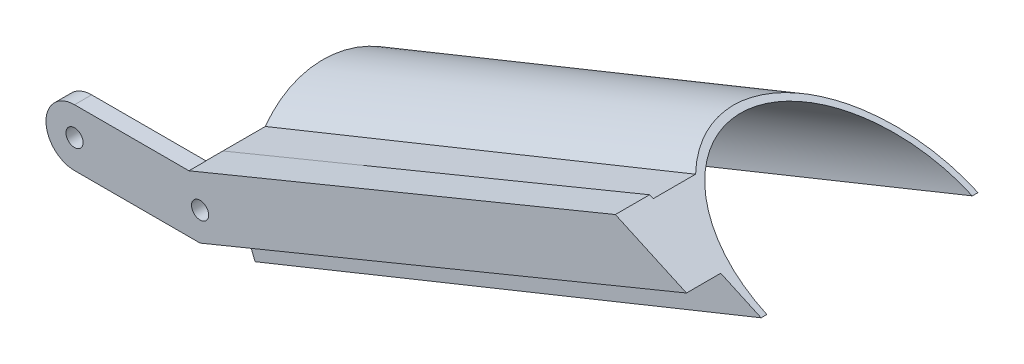
ISO-10303-21;
HEADER;
FILE_DESCRIPTION(('STEP AP214'),'2;1');
FILE_NAME('part.step','',(''),(''),'','','');
FILE_SCHEMA(('AUTOMOTIVE_DESIGN { 1 0 10303 214 1 1 1 1 }'));
ENDSEC;
DATA;
#1=APPLICATION_CONTEXT('core data for automotive mechanical design processes');
#2=APPLICATION_PROTOCOL_DEFINITION('international standard','automotive_design',2000,#1);
#3=PRODUCT_CONTEXT('',#1,'mechanical');
#4=PRODUCT('Part','Part','',(#3));
#5=PRODUCT_RELATED_PRODUCT_CATEGORY('part','',(#4));
#6=PRODUCT_DEFINITION_FORMATION('','',#4);
#7=PRODUCT_DEFINITION_CONTEXT('part definition',#1,'design');
#8=PRODUCT_DEFINITION('design','',#6,#7);
#9=PRODUCT_DEFINITION_SHAPE('','',#8);
#10=(LENGTH_UNIT() NAMED_UNIT(*) SI_UNIT(.MILLI.,.METRE.));
#11=(NAMED_UNIT(*) PLANE_ANGLE_UNIT() SI_UNIT($,.RADIAN.));
#12=(NAMED_UNIT(*) SI_UNIT($,.STERADIAN.) SOLID_ANGLE_UNIT());
#13=UNCERTAINTY_MEASURE_WITH_UNIT(LENGTH_MEASURE(1.E-05),#10,'distance_accuracy_value','');
#14=(GEOMETRIC_REPRESENTATION_CONTEXT(3) GLOBAL_UNCERTAINTY_ASSIGNED_CONTEXT((#13)) GLOBAL_UNIT_ASSIGNED_CONTEXT((#10,
#11,#12)) REPRESENTATION_CONTEXT('',''));
#15=CARTESIAN_POINT('',(0.,0.,0.));
#16=DIRECTION('',(0.,0.,1.));
#17=DIRECTION('',(1.,0.,0.));
#18=AXIS2_PLACEMENT_3D('',#15,#16,#17);
#19=CARTESIAN_POINT('',(22.,0.,-3.));
#20=DIRECTION('',(0.,0.,-1.));
#21=DIRECTION('',(-1.,0.,0.));
#22=AXIS2_PLACEMENT_3D('',#19,#20,#21);
#23=PLANE('',#22);
#24=DIRECTION('',(-0.910039172794663,0.414522259932087,0.));
#25=VECTOR('',#24,1.);
#26=CARTESIAN_POINT('',(47.9776039927981,57.0310440087499,-3.));
#27=LINE('',#26,#25);
#28=CARTESIAN_POINT('',(95.3918753530395,35.433873793622,-3.));
#29=VERTEX_POINT('',#28);
#30=CARTESIAN_POINT('',(94.7654208618462,35.719223412844,-3.));
#31=VERTEX_POINT('',#30);
#32=EDGE_CURVE('E338',#29,#31,#27,.T.);
#33=ORIENTED_EDGE('',*,*,#32,.F.);
#34=DIRECTION('',(-0.927208597794586,-0.374545345953994,0.));
#35=VECTOR('',#34,1.);
#36=CARTESIAN_POINT('',(150.967749391002,57.8837141183942,-3.));
#37=LINE('',#36,#35);
#38=CARTESIAN_POINT('',(19.9901870179728,4.97540790995101,-3.));
#39=VERTEX_POINT('',#38);
#40=EDGE_CURVE('E179',#29,#39,#37,.T.);
#41=ORIENTED_EDGE('',*,*,#40,.T.);
#42=DIRECTION('',(0.924878228166549,0.380263412733207,0.));
#43=VECTOR('',#42,1.);
#44=CARTESIAN_POINT('',(98.5445869727126,37.2730264528967,-3.));
#45=LINE('',#44,#43);
#46=EDGE_CURVE('E200',#39,#31,#45,.T.);
#47=ORIENTED_EDGE('',*,*,#46,.T.);
#48=EDGE_LOOP('',(#33,#41,#47));
#49=FACE_BOUND('',#48,.T.);
#50=ADVANCED_FACE('F42',(#49),#23,.T.);
#51=CARTESIAN_POINT('',(0.,0.,0.));
#52=DIRECTION('',(0.,0.,1.));
#53=DIRECTION('',(1.,0.,0.));
#54=AXIS2_PLACEMENT_3D('',#51,#52,#53);
#55=PLANE('',#54);
#56=CARTESIAN_POINT('',(0.,0.,0.));
#57=DIRECTION('',(0.,0.,1.));
#58=DIRECTION('',(1.,0.,0.));
#59=AXIS2_PLACEMENT_3D('',#56,#57,#58);
#60=CIRCLE('',#59,1.5);
#61=CARTESIAN_POINT('',(1.5,0.,0.));
#62=VERTEX_POINT('',#61);
#63=EDGE_CURVE('E268',#62,#62,#60,.T.);
#64=ORIENTED_EDGE('',*,*,#63,.T.);
#65=EDGE_LOOP('',(#64));
#66=FACE_BOUND('',#65,.T.);
#67=CARTESIAN_POINT('',(22.,0.,0.));
#68=DIRECTION('',(0.,0.,1.));
#69=DIRECTION('',(1.,0.,0.));
#70=AXIS2_PLACEMENT_3D('',#67,#68,#69);
#71=CIRCLE('',#70,1.5);
#72=CARTESIAN_POINT('',(23.5,0.,0.));
#73=VERTEX_POINT('',#72);
#74=EDGE_CURVE('E235',#73,#73,#71,.T.);
#75=ORIENTED_EDGE('',*,*,#74,.T.);
#76=EDGE_LOOP('',(#75));
#77=FACE_BOUND('',#76,.T.);
#78=DIRECTION('',(-0.374545345953993,0.927208597794587,0.));
#79=VECTOR('',#78,1.);
#80=CARTESIAN_POINT('',(22.936363364885,-2.31802149448646,0.));
#81=LINE('',#80,#79);
#82=CARTESIAN_POINT('',(23.7320771990458,-4.28785696671421,0.));
#83=VERTEX_POINT('',#82);
#84=CARTESIAN_POINT('',(22.936363364885,-2.31802149448646,0.));
#85=VERTEX_POINT('',#84);
#86=EDGE_CURVE('E196',#83,#85,#81,.T.);
#87=ORIENTED_EDGE('',*,*,#86,.F.);
#88=DIRECTION('',(-0.924878228166549,-0.380263412733207,0.));
#89=VECTOR('',#88,1.);
#90=CARTESIAN_POINT('',(4.9396925444234,-12.0143404155981,0.));
#91=LINE('',#90,#89);
#92=CARTESIAN_POINT('',(22.,-5.,0.));
#93=VERTEX_POINT('',#92);
#94=EDGE_CURVE('E272',#83,#93,#91,.T.);
#95=ORIENTED_EDGE('',*,*,#94,.T.);
#96=DIRECTION('',(1.,0.,0.));
#97=VECTOR('',#96,1.);
#98=CARTESIAN_POINT('',(0.,-5.,0.));
#99=LINE('',#98,#97);
#100=CARTESIAN_POINT('',(0.,-5.,0.));
#101=VERTEX_POINT('',#100);
#102=EDGE_CURVE('E241',#101,#93,#99,.T.);
#103=ORIENTED_EDGE('',*,*,#102,.F.);
#104=CARTESIAN_POINT('',(0.,0.,0.));
#105=DIRECTION('',(0.,0.,1.));
#106=DIRECTION('',(1.,0.,0.));
#107=AXIS2_PLACEMENT_3D('',#104,#105,#106);
#108=CIRCLE('',#107,5.);
#109=CARTESIAN_POINT('',(0.,5.,0.));
#110=VERTEX_POINT('',#109);
#111=EDGE_CURVE('E278',#110,#101,#108,.T.);
#112=ORIENTED_EDGE('',*,*,#111,.F.);
#113=DIRECTION('',(1.,0.,0.));
#114=VECTOR('',#113,1.);
#115=CARTESIAN_POINT('',(0.,5.,0.));
#116=LINE('',#115,#114);
#117=CARTESIAN_POINT('',(20.05,5.,0.));
#118=VERTEX_POINT('',#117);
#119=EDGE_CURVE('E275',#110,#118,#116,.T.);
#120=ORIENTED_EDGE('',*,*,#119,.T.);
#121=DIRECTION('',(0.924878228166549,0.380263412733207,0.));
#122=VECTOR('',#121,1.);
#123=CARTESIAN_POINT('',(98.5445869727126,37.2730264528967,0.));
#124=LINE('',#123,#122);
#125=CARTESIAN_POINT('',(19.9901870179728,4.97540790995101,0.));
#126=VERTEX_POINT('',#125);
#127=EDGE_CURVE('E65',#126,#118,#124,.T.);
#128=ORIENTED_EDGE('',*,*,#127,.F.);
#129=DIRECTION('',(-0.374545345953994,0.927208597794586,0.));
#130=VECTOR('',#129,1.);
#131=CARTESIAN_POINT('',(19.9901870179728,4.97540790995101,0.));
#132=LINE('',#131,#130);
#133=CARTESIAN_POINT('',(21.063636635115,2.31802149448647,0.));
#134=VERTEX_POINT('',#133);
#135=EDGE_CURVE('E215',#134,#126,#132,.T.);
#136=ORIENTED_EDGE('',*,*,#135,.F.);
#137=CARTESIAN_POINT('',(22.,0.,0.));
#138=DIRECTION('',(0.,0.,1.));
#139=DIRECTION('',(-1.,0.,0.));
#140=AXIS2_PLACEMENT_3D('',#137,#138,#139);
#141=CIRCLE('',#140,2.5);
#142=EDGE_CURVE('E211',#85,#134,#141,.T.);
#143=ORIENTED_EDGE('',*,*,#142,.F.);
#144=EDGE_LOOP('',(#87,#95,#103,#112,#120,#128,#136,#143));
#145=FACE_BOUND('',#144,.T.);
#146=ADVANCED_FACE('F302',(#66,#77,#145),#55,.F.);
#147=CARTESIAN_POINT('',(4.9396925444234,-12.0143404155981,3.));
#148=DIRECTION('',(0.380263412733207,-0.924878228166549,0.));
#149=DIRECTION('',(0.924878228166549,0.380263412733207,0.));
#150=AXIS2_PLACEMENT_3D('',#147,#148,#149);
#151=PLANE('',#150);
#152=DIRECTION('',(0.,0.,-1.));
#153=VECTOR('',#152,1.);
#154=CARTESIAN_POINT('',(107.229222357976,30.0419698198423,3.));
#155=LINE('',#154,#153);
#156=CARTESIAN_POINT('',(107.229222357976,30.0419698198423,3.));
#157=VERTEX_POINT('',#156);
#158=CARTESIAN_POINT('',(107.229222357976,30.0419698198423,-3.));
#159=VERTEX_POINT('',#158);
#160=EDGE_CURVE('E157',#157,#159,#155,.T.);
#161=ORIENTED_EDGE('',*,*,#160,.F.);
#162=DIRECTION('',(-0.924878228166549,-0.380263412733207,0.));
#163=VECTOR('',#162,1.);
#164=CARTESIAN_POINT('',(4.9396925444234,-12.0143404155981,3.));
#165=LINE('',#164,#163);
#166=CARTESIAN_POINT('',(22.,-5.,3.));
#167=VERTEX_POINT('',#166);
#168=EDGE_CURVE('E245',#157,#167,#165,.T.);
#169=ORIENTED_EDGE('',*,*,#168,.T.);
#170=DIRECTION('',(0.,0.,-1.));
#171=VECTOR('',#170,1.);
#172=CARTESIAN_POINT('',(22.,-5.,3.));
#173=LINE('',#172,#171);
#174=EDGE_CURVE('E264',#167,#93,#173,.T.);
#175=ORIENTED_EDGE('',*,*,#174,.T.);
#176=ORIENTED_EDGE('',*,*,#94,.F.);
#177=DIRECTION('',(0.,0.,1.));
#178=VECTOR('',#177,1.);
#179=CARTESIAN_POINT('',(23.7320771990458,-4.28785696671419,-3.));
#180=LINE('',#179,#178);
#181=CARTESIAN_POINT('',(23.7320771990458,-4.28785696671419,-3.));
#182=VERTEX_POINT('',#181);
#183=EDGE_CURVE('E207',#182,#83,#180,.T.);
#184=ORIENTED_EDGE('',*,*,#183,.F.);
#185=DIRECTION('',(-0.924878228166549,-0.380263412733207,0.));
#186=VECTOR('',#185,1.);
#187=CARTESIAN_POINT('',(111.008388468843,31.595772859895,-3.));
#188=LINE('',#187,#186);
#189=EDGE_CURVE('E204',#159,#182,#188,.T.);
#190=ORIENTED_EDGE('',*,*,#189,.F.);
#191=EDGE_LOOP('',(#161,#169,#175,#176,#184,#190));
#192=FACE_BOUND('',#191,.T.);
#193=ADVANCED_FACE('F322',(#192),#151,.T.);
#194=CARTESIAN_POINT('',(1.14074851739701,-2.77453321099285,3.));
#195=DIRECTION('',(-0.380263412733207,0.924878228166549,0.));
#196=DIRECTION('',(-0.924878228166549,-0.380263412733207,0.));
#197=AXIS2_PLACEMENT_3D('',#194,#195,#196);
#198=PLANE('',#197);
#199=DIRECTION('',(0.,0.,1.));
#200=VECTOR('',#199,1.);
#201=CARTESIAN_POINT('',(94.7654208618463,35.7192234128439,3.));
#202=LINE('',#201,#200);
#203=CARTESIAN_POINT('',(94.7654208618463,35.7192234128439,3.));
#204=VERTEX_POINT('',#203);
#205=EDGE_CURVE('E336',#31,#204,#202,.T.);
#206=ORIENTED_EDGE('',*,*,#205,.F.);
#207=ORIENTED_EDGE('',*,*,#46,.F.);
#208=DIRECTION('',(0.,0.,1.));
#209=VECTOR('',#208,1.);
#210=CARTESIAN_POINT('',(19.9901870179728,4.97540790995101,-3.));
#211=LINE('',#210,#209);
#212=EDGE_CURVE('E223',#39,#126,#211,.T.);
#213=ORIENTED_EDGE('',*,*,#212,.T.);
#214=ORIENTED_EDGE('',*,*,#127,.T.);
#215=DIRECTION('',(0.,0.,-1.));
#216=VECTOR('',#215,1.);
#217=CARTESIAN_POINT('',(20.05,5.,3.));
#218=LINE('',#217,#216);
#219=CARTESIAN_POINT('',(20.05,5.,3.));
#220=VERTEX_POINT('',#219);
#221=EDGE_CURVE('E51',#220,#118,#218,.T.);
#222=ORIENTED_EDGE('',*,*,#221,.F.);
#223=DIRECTION('',(0.924878228166549,0.380263412733207,0.));
#224=VECTOR('',#223,1.);
#225=CARTESIAN_POINT('',(1.14074851739701,-2.77453321099285,3.));
#226=LINE('',#225,#224);
#227=EDGE_CURVE('E248',#220,#204,#226,.T.);
#228=ORIENTED_EDGE('',*,*,#227,.T.);
#229=EDGE_LOOP('',(#206,#207,#213,#214,#222,#228));
#230=FACE_BOUND('',#229,.T.);
#231=ADVANCED_FACE('F304',(#230),#198,.T.);
#232=CARTESIAN_POINT('',(0.,5.,3.));
#233=DIRECTION('',(0.,1.,0.));
#234=DIRECTION('',(0.,0.,1.));
#235=AXIS2_PLACEMENT_3D('',#232,#233,#234);
#236=PLANE('',#235);
#237=ORIENTED_EDGE('',*,*,#119,.F.);
#238=DIRECTION('',(0.,0.,-1.));
#239=VECTOR('',#238,1.);
#240=CARTESIAN_POINT('',(0.,5.,3.));
#241=LINE('',#240,#239);
#242=CARTESIAN_POINT('',(0.,5.,3.));
#243=VERTEX_POINT('',#242);
#244=EDGE_CURVE('E292',#243,#110,#241,.T.);
#245=ORIENTED_EDGE('',*,*,#244,.F.);
#246=DIRECTION('',(1.,0.,0.));
#247=VECTOR('',#246,1.);
#248=CARTESIAN_POINT('',(0.,5.,3.));
#249=LINE('',#248,#247);
#250=EDGE_CURVE('E252',#243,#220,#249,.T.);
#251=ORIENTED_EDGE('',*,*,#250,.T.);
#252=ORIENTED_EDGE('',*,*,#221,.T.);
#253=EDGE_LOOP('',(#237,#245,#251,#252));
#254=FACE_BOUND('',#253,.T.);
#255=ADVANCED_FACE('F297',(#254),#236,.T.);
#256=CARTESIAN_POINT('',(0.,0.,3.));
#257=DIRECTION('',(0.,0.,-1.));
#258=DIRECTION('',(-1.,0.,0.));
#259=AXIS2_PLACEMENT_3D('',#256,#257,#258);
#260=CYLINDRICAL_SURFACE('',#259,5.);
#261=ORIENTED_EDGE('',*,*,#111,.T.);
#262=DIRECTION('',(0.,0.,-1.));
#263=VECTOR('',#262,1.);
#264=CARTESIAN_POINT('',(0.,-5.,3.));
#265=LINE('',#264,#263);
#266=CARTESIAN_POINT('',(0.,-5.,3.));
#267=VERTEX_POINT('',#266);
#268=EDGE_CURVE('E288',#267,#101,#265,.T.);
#269=ORIENTED_EDGE('',*,*,#268,.F.);
#270=CARTESIAN_POINT('',(0.,0.,3.));
#271=DIRECTION('',(0.,0.,1.));
#272=DIRECTION('',(1.,0.,0.));
#273=AXIS2_PLACEMENT_3D('',#270,#271,#272);
#274=CIRCLE('',#273,5.);
#275=EDGE_CURVE('E256',#243,#267,#274,.T.);
#276=ORIENTED_EDGE('',*,*,#275,.F.);
#277=ORIENTED_EDGE('',*,*,#244,.T.);
#278=EDGE_LOOP('',(#261,#269,#276,#277));
#279=FACE_BOUND('',#278,.T.);
#280=ADVANCED_FACE('F330',(#279),#260,.T.);
#281=CARTESIAN_POINT('',(0.,0.,3.));
#282=DIRECTION('',(0.,0.,-1.));
#283=DIRECTION('',(-1.,0.,0.));
#284=AXIS2_PLACEMENT_3D('',#281,#282,#283);
#285=CYLINDRICAL_SURFACE('',#284,1.5);
#286=CARTESIAN_POINT('',(0.,0.,3.));
#287=DIRECTION('',(0.,0.,1.));
#288=DIRECTION('',(1.,0.,0.));
#289=AXIS2_PLACEMENT_3D('',#286,#287,#288);
#290=CIRCLE('',#289,1.5);
#291=CARTESIAN_POINT('',(1.5,0.,3.));
#292=VERTEX_POINT('',#291);
#293=EDGE_CURVE('E240',#292,#292,#290,.T.);
#294=ORIENTED_EDGE('',*,*,#293,.T.);
#295=EDGE_LOOP('',(#294));
#296=FACE_BOUND('',#295,.T.);
#297=ORIENTED_EDGE('',*,*,#63,.F.);
#298=EDGE_LOOP('',(#297));
#299=FACE_BOUND('',#298,.T.);
#300=ADVANCED_FACE('F417',(#296,#299),#285,.F.);
#301=CARTESIAN_POINT('',(22.,0.,3.));
#302=DIRECTION('',(0.,0.,-1.));
#303=DIRECTION('',(-1.,0.,0.));
#304=AXIS2_PLACEMENT_3D('',#301,#302,#303);
#305=CYLINDRICAL_SURFACE('',#304,1.5);
#306=CARTESIAN_POINT('',(22.,0.,3.));
#307=DIRECTION('',(0.,0.,1.));
#308=DIRECTION('',(1.,0.,0.));
#309=AXIS2_PLACEMENT_3D('',#306,#307,#308);
#310=CIRCLE('',#309,1.5);
#311=CARTESIAN_POINT('',(23.5,0.,3.));
#312=VERTEX_POINT('',#311);
#313=EDGE_CURVE('E236',#312,#312,#310,.T.);
#314=ORIENTED_EDGE('',*,*,#313,.T.);
#315=EDGE_LOOP('',(#314));
#316=FACE_BOUND('',#315,.T.);
#317=ORIENTED_EDGE('',*,*,#74,.F.);
#318=EDGE_LOOP('',(#317));
#319=FACE_BOUND('',#318,.T.);
#320=ADVANCED_FACE('F44',(#316,#319),#305,.F.);
#321=CARTESIAN_POINT('',(0.,-5.,3.));
#322=DIRECTION('',(0.,1.,0.));
#323=DIRECTION('',(0.,0.,1.));
#324=AXIS2_PLACEMENT_3D('',#321,#322,#323);
#325=PLANE('',#324);
#326=ORIENTED_EDGE('',*,*,#102,.T.);
#327=ORIENTED_EDGE('',*,*,#174,.F.);
#328=DIRECTION('',(1.,0.,0.));
#329=VECTOR('',#328,1.);
#330=CARTESIAN_POINT('',(0.,-5.,3.));
#331=LINE('',#330,#329);
#332=EDGE_CURVE('E260',#267,#167,#331,.T.);
#333=ORIENTED_EDGE('',*,*,#332,.F.);
#334=ORIENTED_EDGE('',*,*,#268,.T.);
#335=EDGE_LOOP('',(#326,#327,#333,#334));
#336=FACE_BOUND('',#335,.T.);
#337=ADVANCED_FACE('F326',(#336),#325,.F.);
#338=CARTESIAN_POINT('',(0.,0.,3.));
#339=DIRECTION('',(0.,0.,1.));
#340=DIRECTION('',(1.,0.,0.));
#341=AXIS2_PLACEMENT_3D('',#338,#339,#340);
#342=PLANE('',#341);
#343=DIRECTION('',(0.910039172794663,-0.414522259932087,0.));
#344=VECTOR('',#343,1.);
#345=CARTESIAN_POINT('',(29.7578354803406,65.3301368884884,3.));
#346=LINE('',#345,#344);
#347=EDGE_CURVE('E335',#204,#157,#346,.T.);
#348=ORIENTED_EDGE('',*,*,#347,.F.);
#349=ORIENTED_EDGE('',*,*,#227,.F.);
#350=ORIENTED_EDGE('',*,*,#250,.F.);
#351=ORIENTED_EDGE('',*,*,#275,.T.);
#352=ORIENTED_EDGE('',*,*,#332,.T.);
#353=ORIENTED_EDGE('',*,*,#168,.F.);
#354=EDGE_LOOP('',(#348,#349,#350,#351,#352,#353));
#355=FACE_BOUND('',#354,.T.);
#356=ORIENTED_EDGE('',*,*,#313,.F.);
#357=EDGE_LOOP('',(#356));
#358=FACE_BOUND('',#357,.T.);
#359=ORIENTED_EDGE('',*,*,#293,.F.);
#360=EDGE_LOOP('',(#359));
#361=FACE_BOUND('',#360,.T.);
#362=ADVANCED_FACE('F333',(#355,#358,#361),#342,.T.);
#363=CARTESIAN_POINT('',(22.936363364885,-2.31802149448646,-3.));
#364=DIRECTION('',(0.927208597794587,0.374545345953993,0.));
#365=DIRECTION('',(-0.374545345953993,0.927208597794587,0.));
#366=AXIS2_PLACEMENT_3D('',#363,#364,#365);
#367=PLANE('',#366);
#368=ORIENTED_EDGE('',*,*,#86,.T.);
#369=DIRECTION('',(0.,0.,1.));
#370=VECTOR('',#369,1.);
#371=CARTESIAN_POINT('',(22.936363364885,-2.31802149448646,-3.));
#372=LINE('',#371,#370);
#373=CARTESIAN_POINT('',(22.936363364885,-2.31802149448646,-3.));
#374=VERTEX_POINT('',#373);
#375=EDGE_CURVE('E231',#374,#85,#372,.T.);
#376=ORIENTED_EDGE('',*,*,#375,.F.);
#377=DIRECTION('',(-0.374545345953994,0.927208597794586,0.));
#378=VECTOR('',#377,1.);
#379=CARTESIAN_POINT('',(25.6368359347664,-9.00319703317821,-3.00000000000001));
#380=LINE('',#379,#378);
#381=CARTESIAN_POINT('',(21.063636635115,2.31802149448647,-3.));
#382=VERTEX_POINT('',#381);
#383=EDGE_CURVE('E365',#374,#382,#380,.T.);
#384=ORIENTED_EDGE('',*,*,#383,.T.);
#385=DIRECTION('',(0.,0.,1.));
#386=VECTOR('',#385,1.);
#387=CARTESIAN_POINT('',(21.063636635115,2.31802149448647,-3.));
#388=LINE('',#387,#386);
#389=EDGE_CURVE('E227',#382,#134,#388,.T.);
#390=ORIENTED_EDGE('',*,*,#389,.T.);
#391=ORIENTED_EDGE('',*,*,#135,.T.);
#392=ORIENTED_EDGE('',*,*,#212,.F.);
#393=DIRECTION('',(0.,0.,-1.));
#394=VECTOR('',#393,1.);
#395=CARTESIAN_POINT('',(19.9901870179728,4.975407909951,-3.));
#396=LINE('',#395,#394);
#397=CARTESIAN_POINT('',(19.9901870179728,4.975407909951,-10.4365247501282));
#398=VERTEX_POINT('',#397);
#399=EDGE_CURVE('E312',#39,#398,#396,.T.);
#400=ORIENTED_EDGE('',*,*,#399,.T.);
#401=CARTESIAN_POINT('',(25.6368359347664,-9.00319703317821,-22.));
#402=DIRECTION('',(-0.927208597794586,-0.374545345953994,0.));
#403=DIRECTION('',(0.374545345953994,-0.927208597794586,0.));
#404=AXIS2_PLACEMENT_3D('',#401,#402,#403);
#405=CIRCLE('',#404,19.);
#406=CARTESIAN_POINT('',(25.6368359347664,-9.00319703317821,-41.));
#407=VERTEX_POINT('',#406);
#408=EDGE_CURVE('E348',#398,#407,#405,.T.);
#409=ORIENTED_EDGE('',*,*,#408,.T.);
#410=DIRECTION('',(0.,0.,1.));
#411=VECTOR('',#410,1.);
#412=CARTESIAN_POINT('',(25.6368359347664,-9.00319703317821,-41.));
#413=LINE('',#412,#411);
#414=CARTESIAN_POINT('',(25.6368359347664,-9.00319703317821,-40.));
#415=VERTEX_POINT('',#414);
#416=EDGE_CURVE('E351',#407,#415,#413,.T.);
#417=ORIENTED_EDGE('',*,*,#416,.T.);
#418=CARTESIAN_POINT('',(25.6368359347664,-9.00319703317821,-22.));
#419=DIRECTION('',(0.927208597794586,0.374545345953994,0.));
#420=DIRECTION('',(0.374545345953994,-0.927208597794586,0.));
#421=AXIS2_PLACEMENT_3D('',#418,#419,#420);
#422=CIRCLE('',#421,18.);
#423=CARTESIAN_POINT('',(25.6368359347664,-9.00319703317821,-4.));
#424=VERTEX_POINT('',#423);
#425=EDGE_CURVE('E358',#415,#424,#422,.T.);
#426=ORIENTED_EDGE('',*,*,#425,.T.);
#427=DIRECTION('',(0.,0.,1.));
#428=VECTOR('',#427,1.);
#429=CARTESIAN_POINT('',(25.6368359347664,-9.00319703317821,-3.00000000000001));
#430=LINE('',#429,#428);
#431=CARTESIAN_POINT('',(25.6368359347664,-9.00319703317821,-3.00000000000001));
#432=VERTEX_POINT('',#431);
#433=EDGE_CURVE('E362',#424,#432,#430,.T.);
#434=ORIENTED_EDGE('',*,*,#433,.T.);
#435=EDGE_CURVE('E177',#432,#182,#380,.T.);
#436=ORIENTED_EDGE('',*,*,#435,.T.);
#437=ORIENTED_EDGE('',*,*,#183,.T.);
#438=EDGE_LOOP('',(#368,#376,#384,#390,#391,#392,#400,#409,#417,#426,#434,#436,#437));
#439=FACE_BOUND('',#438,.T.);
#440=ADVANCED_FACE('F309',(#439),#367,.F.);
#441=CARTESIAN_POINT('',(22.,0.,-3.));
#442=DIRECTION('',(0.,0.,1.));
#443=DIRECTION('',(1.,0.,0.));
#444=AXIS2_PLACEMENT_3D('',#441,#442,#443);
#445=CYLINDRICAL_SURFACE('',#444,2.5);
#446=ORIENTED_EDGE('',*,*,#142,.T.);
#447=ORIENTED_EDGE('',*,*,#389,.F.);
#448=CARTESIAN_POINT('',(22.,0.,-3.));
#449=DIRECTION('',(0.,0.,1.));
#450=DIRECTION('',(-1.,0.,0.));
#451=AXIS2_PLACEMENT_3D('',#448,#449,#450);
#452=CIRCLE('',#451,2.5);
#453=EDGE_CURVE('E197',#374,#382,#452,.T.);
#454=ORIENTED_EDGE('',*,*,#453,.F.);
#455=ORIENTED_EDGE('',*,*,#375,.T.);
#456=EDGE_LOOP('',(#446,#447,#454,#455));
#457=FACE_BOUND('',#456,.T.);
#458=ADVANCED_FACE('F316',(#457),#445,.F.);
#459=CARTESIAN_POINT('',(156.614398307796,43.905109175265,-3.00000000000001));
#460=DIRECTION('',(0.,0.,1.));
#461=DIRECTION('',(0.,-1.,0.));
#462=AXIS2_PLACEMENT_3D('',#459,#460,#461);
#463=PLANE('',#462);
#464=ORIENTED_EDGE('',*,*,#383,.F.);
#465=ORIENTED_EDGE('',*,*,#453,.T.);
#466=EDGE_LOOP('',(#464,#465));
#467=FACE_BOUND('',#466,.T.);
#468=ADVANCED_FACE('F408',(#467),#463,.T.);
#469=CARTESIAN_POINT('',(156.614398307796,43.905109175265,-22.));
#470=DIRECTION('',(-0.927208597794586,-0.374545345953994,0.));
#471=DIRECTION('',(0.374545345953994,-0.927208597794586,0.));
#472=AXIS2_PLACEMENT_3D('',#469,#470,#471);
#473=CYLINDRICAL_SURFACE('',#472,19.);
#474=CARTESIAN_POINT('',(114.310473312684,26.8164645485937,-22.));
#475=DIRECTION('',(-0.414522259932087,-0.910039172794663,0.));
#476=DIRECTION('',(-0.910039172794663,0.414522259932087,0.));
#477=AXIS2_PLACEMENT_3D('',#474,#475,#476);
#478=ELLIPSE('',#477,26.1996856685276,19.);
#479=CARTESIAN_POINT('',(114.310473312684,26.8164645485937,-41.));
#480=VERTEX_POINT('',#479);
#481=CARTESIAN_POINT('',(95.3918753530395,35.433873793622,-10.4365247501282));
#482=VERTEX_POINT('',#481);
#483=EDGE_CURVE('E57',#480,#482,#478,.F.);
#484=ORIENTED_EDGE('',*,*,#483,.F.);
#485=DIRECTION('',(-0.927208597794586,-0.374545345953994,0.));
#486=VECTOR('',#485,1.);
#487=CARTESIAN_POINT('',(156.614398307796,43.905109175265,-41.));
#488=LINE('',#487,#486);
#489=EDGE_CURVE('E191',#480,#407,#488,.T.);
#490=ORIENTED_EDGE('',*,*,#489,.T.);
#491=ORIENTED_EDGE('',*,*,#408,.F.);
#492=DIRECTION('',(-0.927208597794586,-0.374545345953994,0.));
#493=VECTOR('',#492,1.);
#494=CARTESIAN_POINT('',(150.967749391002,57.8837141183942,-10.4365247501282));
#495=LINE('',#494,#493);
#496=EDGE_CURVE('E183',#482,#398,#495,.T.);
#497=ORIENTED_EDGE('',*,*,#496,.F.);
#498=EDGE_LOOP('',(#484,#490,#491,#497));
#499=FACE_BOUND('',#498,.T.);
#500=ADVANCED_FACE('F383',(#499),#473,.T.);
#501=CARTESIAN_POINT('',(156.614398307796,43.905109175265,-41.));
#502=DIRECTION('',(0.374545345953994,-0.927208597794586,0.));
#503=DIRECTION('',(0.927208597794586,0.374545345953994,0.));
#504=AXIS2_PLACEMENT_3D('',#501,#502,#503);
#505=PLANE('',#504);
#506=DIRECTION('',(0.,0.,-1.));
#507=VECTOR('',#506,1.);
#508=CARTESIAN_POINT('',(114.310473312684,26.8164645485937,45.));
#509=LINE('',#508,#507);
#510=CARTESIAN_POINT('',(114.310473312684,26.8164645485937,-40.));
#511=VERTEX_POINT('',#510);
#512=EDGE_CURVE('E172',#511,#480,#509,.T.);
#513=ORIENTED_EDGE('',*,*,#512,.F.);
#514=DIRECTION('',(-0.927208597794586,-0.374545345953994,0.));
#515=VECTOR('',#514,1.);
#516=CARTESIAN_POINT('',(156.614398307796,43.905109175265,-40.));
#517=LINE('',#516,#515);
#518=EDGE_CURVE('E185',#511,#415,#517,.T.);
#519=ORIENTED_EDGE('',*,*,#518,.T.);
#520=ORIENTED_EDGE('',*,*,#416,.F.);
#521=ORIENTED_EDGE('',*,*,#489,.F.);
#522=EDGE_LOOP('',(#513,#519,#520,#521));
#523=FACE_BOUND('',#522,.T.);
#524=ADVANCED_FACE('F381',(#523),#505,.T.);
#525=CARTESIAN_POINT('',(156.614398307796,43.905109175265,-22.));
#526=DIRECTION('',(-0.927208597794586,-0.374545345953994,0.));
#527=DIRECTION('',(0.374545345953994,-0.927208597794586,0.));
#528=AXIS2_PLACEMENT_3D('',#525,#526,#527);
#529=CYLINDRICAL_SURFACE('',#528,18.);
#530=CARTESIAN_POINT('',(114.310473312684,26.8164645485937,-22.));
#531=DIRECTION('',(-0.414522259932087,-0.910039172794663,0.));
#532=DIRECTION('',(-0.910039172794663,0.414522259932087,0.));
#533=AXIS2_PLACEMENT_3D('',#530,#531,#532);
#534=ELLIPSE('',#533,24.8207548438683,18.);
#535=CARTESIAN_POINT('',(114.310473312684,26.8164645485937,-4.));
#536=VERTEX_POINT('',#535);
#537=EDGE_CURVE('E162',#536,#511,#534,.T.);
#538=ORIENTED_EDGE('',*,*,#537,.F.);
#539=DIRECTION('',(-0.927208597794586,-0.374545345953994,0.));
#540=VECTOR('',#539,1.);
#541=CARTESIAN_POINT('',(156.614398307796,43.905109175265,-4.));
#542=LINE('',#541,#540);
#543=EDGE_CURVE('E170',#536,#424,#542,.T.);
#544=ORIENTED_EDGE('',*,*,#543,.T.);
#545=ORIENTED_EDGE('',*,*,#425,.F.);
#546=ORIENTED_EDGE('',*,*,#518,.F.);
#547=EDGE_LOOP('',(#538,#544,#545,#546));
#548=FACE_BOUND('',#547,.T.);
#549=ADVANCED_FACE('F386',(#548),#529,.F.);
#550=CARTESIAN_POINT('',(156.614398307796,43.905109175265,-3.00000000000001));
#551=DIRECTION('',(0.374545345953994,-0.927208597794586,0.));
#552=DIRECTION('',(0.927208597794586,0.374545345953994,0.));
#553=AXIS2_PLACEMENT_3D('',#550,#551,#552);
#554=PLANE('',#553);
#555=CARTESIAN_POINT('',(114.310473312684,26.8164645485937,-3.));
#556=VERTEX_POINT('',#555);
#557=EDGE_CURVE('E154',#556,#536,#509,.T.);
#558=ORIENTED_EDGE('',*,*,#557,.F.);
#559=DIRECTION('',(-0.927208597794586,-0.374545345953994,0.));
#560=VECTOR('',#559,1.);
#561=CARTESIAN_POINT('',(156.614398307796,43.905109175265,-3.00000000000001));
#562=LINE('',#561,#560);
#563=EDGE_CURVE('E168',#556,#432,#562,.T.);
#564=ORIENTED_EDGE('',*,*,#563,.T.);
#565=ORIENTED_EDGE('',*,*,#433,.F.);
#566=ORIENTED_EDGE('',*,*,#543,.F.);
#567=EDGE_LOOP('',(#558,#564,#565,#566));
#568=FACE_BOUND('',#567,.T.);
#569=ADVANCED_FACE('F166',(#568),#554,.T.);
#570=DIRECTION('',(0.910039172794663,-0.414522259932087,0.));
#571=VECTOR('',#570,1.);
#572=CARTESIAN_POINT('',(142.89899475058,13.7944113570139,-3.00000000000002));
#573=LINE('',#572,#571);
#574=EDGE_CURVE('E151',#159,#556,#573,.T.);
#575=ORIENTED_EDGE('',*,*,#574,.F.);
#576=ORIENTED_EDGE('',*,*,#189,.T.);
#577=ORIENTED_EDGE('',*,*,#435,.F.);
#578=ORIENTED_EDGE('',*,*,#563,.F.);
#579=EDGE_LOOP('',(#575,#576,#577,#578));
#580=FACE_BOUND('',#579,.T.);
#581=ADVANCED_FACE('F175',(#580),#463,.T.);
#582=CARTESIAN_POINT('',(150.967749391002,57.8837141183942,-3.));
#583=DIRECTION('',(-0.374545345953994,0.927208597794586,0.));
#584=DIRECTION('',(-0.927208597794586,-0.374545345953994,0.));
#585=AXIS2_PLACEMENT_3D('',#582,#583,#584);
#586=PLANE('',#585);
#587=DIRECTION('',(0.,0.,1.));
#588=VECTOR('',#587,1.);
#589=CARTESIAN_POINT('',(95.3918753530395,35.433873793622,-3.00000000000003));
#590=LINE('',#589,#588);
#591=EDGE_CURVE('E11',#482,#29,#590,.T.);
#592=ORIENTED_EDGE('',*,*,#591,.F.);
#593=ORIENTED_EDGE('',*,*,#496,.T.);
#594=ORIENTED_EDGE('',*,*,#399,.F.);
#595=ORIENTED_EDGE('',*,*,#40,.F.);
#596=EDGE_LOOP('',(#592,#593,#594,#595));
#597=FACE_BOUND('',#596,.T.);
#598=ADVANCED_FACE('F344',(#597),#586,.T.);
#599=CARTESIAN_POINT('',(114.310473312684,26.8164645485937,45.));
#600=DIRECTION('',(-0.414522259932087,-0.910039172794663,0.));
#601=DIRECTION('',(0.910039172794663,-0.414522259932087,0.));
#602=AXIS2_PLACEMENT_3D('',#599,#600,#601);
#603=PLANE('',#602);
#604=ORIENTED_EDGE('',*,*,#537,.T.);
#605=ORIENTED_EDGE('',*,*,#512,.T.);
#606=ORIENTED_EDGE('',*,*,#483,.T.);
#607=ORIENTED_EDGE('',*,*,#591,.T.);
#608=ORIENTED_EDGE('',*,*,#32,.T.);
#609=ORIENTED_EDGE('',*,*,#205,.T.);
#610=ORIENTED_EDGE('',*,*,#347,.T.);
#611=ORIENTED_EDGE('',*,*,#160,.T.);
#612=ORIENTED_EDGE('',*,*,#574,.T.);
#613=ORIENTED_EDGE('',*,*,#557,.T.);
#614=EDGE_LOOP('',(#604,#605,#606,#607,#608,#609,#610,#611,#612,#613));
#615=FACE_BOUND('',#614,.T.);
#616=ADVANCED_FACE('F153',(#615),#603,.F.);
#617=CLOSED_SHELL('',(#50,#146,#193,#231,#255,#280,#300,#320,#337,#362,#440,#458,#468,#500,#524,
#549,#569,#581,#598,#616));
#618=MANIFOLD_SOLID_BREP('B2',#617);
#619=ADVANCED_BREP_SHAPE_REPRESENTATION('',(#18,#618),#14);
#620=SHAPE_DEFINITION_REPRESENTATION(#9,#619);
ENDSEC;
END-ISO-10303-21;
